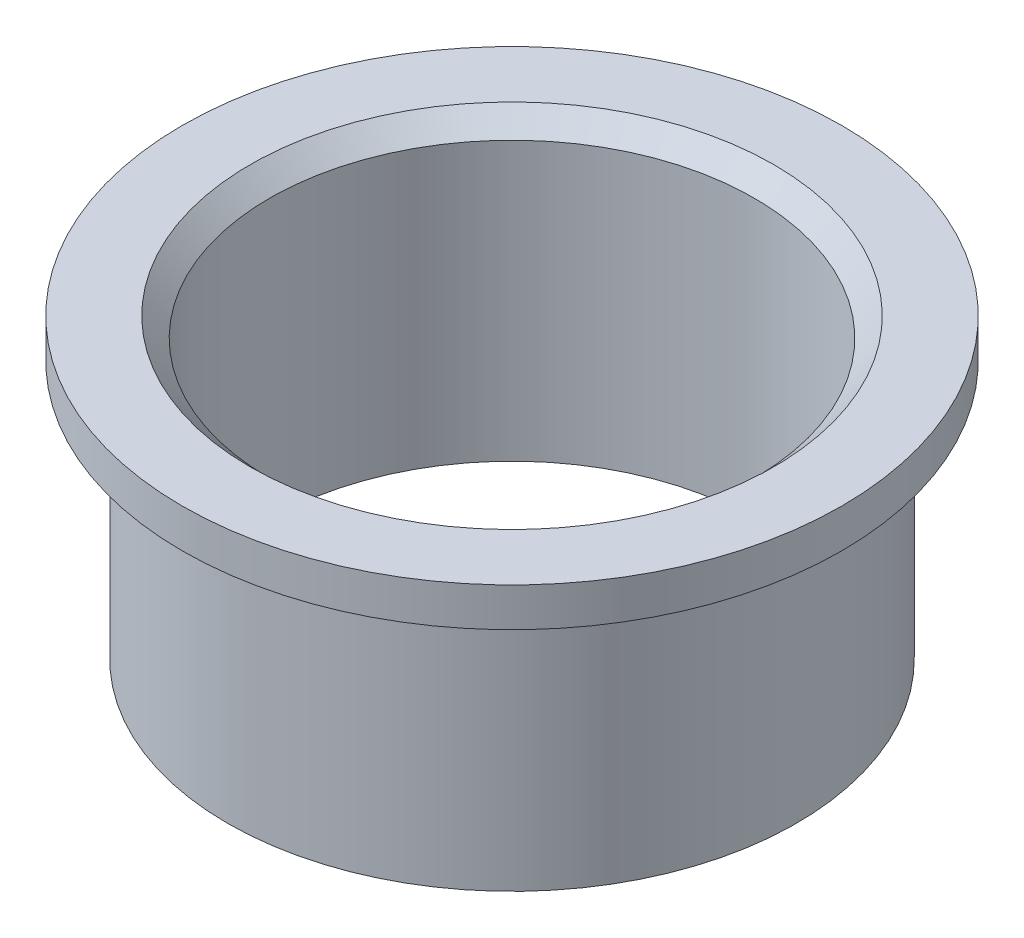
ISO-10303-21;
HEADER;
FILE_DESCRIPTION(('STEP AP214'),'2;1');
FILE_NAME('part.step','',(''),(''),'','','');
FILE_SCHEMA(('AUTOMOTIVE_DESIGN { 1 0 10303 214 1 1 1 1 }'));
ENDSEC;
DATA;
#1=APPLICATION_CONTEXT('core data for automotive mechanical design processes');
#2=APPLICATION_PROTOCOL_DEFINITION('international standard','automotive_design',2000,#1);
#3=PRODUCT_CONTEXT('',#1,'mechanical');
#4=PRODUCT('Part','Part','',(#3));
#5=PRODUCT_RELATED_PRODUCT_CATEGORY('part','',(#4));
#6=PRODUCT_DEFINITION_FORMATION('','',#4);
#7=PRODUCT_DEFINITION_CONTEXT('part definition',#1,'design');
#8=PRODUCT_DEFINITION('design','',#6,#7);
#9=PRODUCT_DEFINITION_SHAPE('','',#8);
#10=(LENGTH_UNIT() NAMED_UNIT(*) SI_UNIT(.MILLI.,.METRE.));
#11=(NAMED_UNIT(*) PLANE_ANGLE_UNIT() SI_UNIT($,.RADIAN.));
#12=(NAMED_UNIT(*) SI_UNIT($,.STERADIAN.) SOLID_ANGLE_UNIT());
#13=UNCERTAINTY_MEASURE_WITH_UNIT(LENGTH_MEASURE(1.E-05),#10,'distance_accuracy_value','');
#14=(GEOMETRIC_REPRESENTATION_CONTEXT(3) GLOBAL_UNCERTAINTY_ASSIGNED_CONTEXT((#13)) GLOBAL_UNIT_ASSIGNED_CONTEXT((#10,
#11,#12)) REPRESENTATION_CONTEXT('',''));
#15=CARTESIAN_POINT('',(0.,0.,0.));
#16=DIRECTION('',(0.,0.,1.));
#17=DIRECTION('',(1.,0.,0.));
#18=AXIS2_PLACEMENT_3D('',#15,#16,#17);
#19=CARTESIAN_POINT('',(0.,0.,0.));
#20=DIRECTION('',(0.,1.,0.));
#21=DIRECTION('',(0.,0.,1.));
#22=AXIS2_PLACEMENT_3D('',#19,#20,#21);
#23=CYLINDRICAL_SURFACE('',#22,51.);
#24=CARTESIAN_POINT('',(0.,-6.,0.));
#25=DIRECTION('',(0.,1.,0.));
#26=DIRECTION('',(0.,0.,1.));
#27=AXIS2_PLACEMENT_3D('',#24,#25,#26);
#28=CIRCLE('',#27,51.);
#29=CARTESIAN_POINT('',(0.,-6.,51.));
#30=VERTEX_POINT('',#29);
#31=EDGE_CURVE('E56',#30,#30,#28,.T.);
#32=ORIENTED_EDGE('',*,*,#31,.T.);
#33=EDGE_LOOP('',(#32));
#34=FACE_BOUND('',#33,.T.);
#35=CARTESIAN_POINT('',(0.,0.,0.));
#36=DIRECTION('',(0.,1.,0.));
#37=DIRECTION('',(0.,0.,1.));
#38=AXIS2_PLACEMENT_3D('',#35,#36,#37);
#39=CIRCLE('',#38,51.);
#40=CARTESIAN_POINT('',(0.,0.,51.));
#41=VERTEX_POINT('',#40);
#42=EDGE_CURVE('E10',#41,#41,#39,.T.);
#43=ORIENTED_EDGE('',*,*,#42,.F.);
#44=EDGE_LOOP('',(#43));
#45=FACE_BOUND('',#44,.T.);
#46=ADVANCED_FACE('F31',(#34,#45),#23,.T.);
#47=CARTESIAN_POINT('',(-51.,0.,0.));
#48=DIRECTION('',(0.,1.,0.));
#49=DIRECTION('',(0.,0.,1.));
#50=AXIS2_PLACEMENT_3D('',#47,#48,#49);
#51=PLANE('',#50);
#52=ORIENTED_EDGE('',*,*,#42,.T.);
#53=EDGE_LOOP('',(#52));
#54=FACE_BOUND('',#53,.T.);
#55=CARTESIAN_POINT('',(0.,0.,0.));
#56=DIRECTION('',(0.,1.,0.));
#57=DIRECTION('',(0.,0.,1.));
#58=AXIS2_PLACEMENT_3D('',#55,#56,#57);
#59=CIRCLE('',#58,40.5);
#60=CARTESIAN_POINT('',(0.,0.,40.5));
#61=VERTEX_POINT('',#60);
#62=EDGE_CURVE('E37',#61,#61,#59,.T.);
#63=ORIENTED_EDGE('',*,*,#62,.F.);
#64=EDGE_LOOP('',(#63));
#65=FACE_BOUND('',#64,.T.);
#66=ADVANCED_FACE('F74',(#54,#65),#51,.T.);
#67=CARTESIAN_POINT('',(0.,-3.,0.));
#68=DIRECTION('',(0.,1.,0.));
#69=DIRECTION('',(0.,0.,1.));
#70=AXIS2_PLACEMENT_3D('',#67,#68,#69);
#71=CONICAL_SURFACE('',#70,37.5,0.785398163397448);
#72=ORIENTED_EDGE('',*,*,#62,.T.);
#73=EDGE_LOOP('',(#72));
#74=FACE_BOUND('',#73,.T.);
#75=CARTESIAN_POINT('',(0.,-3.,0.));
#76=DIRECTION('',(0.,1.,0.));
#77=DIRECTION('',(0.,0.,1.));
#78=AXIS2_PLACEMENT_3D('',#75,#76,#77);
#79=CIRCLE('',#78,37.5);
#80=CARTESIAN_POINT('',(0.,-3.,37.5));
#81=VERTEX_POINT('',#80);
#82=EDGE_CURVE('E41',#81,#81,#79,.T.);
#83=ORIENTED_EDGE('',*,*,#82,.F.);
#84=EDGE_LOOP('',(#83));
#85=FACE_BOUND('',#84,.T.);
#86=ADVANCED_FACE('F78',(#74,#85),#71,.F.);
#87=CARTESIAN_POINT('',(0.,0.,0.));
#88=DIRECTION('',(0.,1.,0.));
#89=DIRECTION('',(0.,0.,1.));
#90=AXIS2_PLACEMENT_3D('',#87,#88,#89);
#91=CYLINDRICAL_SURFACE('',#90,37.5);
#92=ORIENTED_EDGE('',*,*,#82,.T.);
#93=EDGE_LOOP('',(#92));
#94=FACE_BOUND('',#93,.T.);
#95=CARTESIAN_POINT('',(0.,-46.,0.));
#96=DIRECTION('',(0.,1.,0.));
#97=DIRECTION('',(0.,0.,1.));
#98=AXIS2_PLACEMENT_3D('',#95,#96,#97);
#99=CIRCLE('',#98,37.5);
#100=CARTESIAN_POINT('',(0.,-46.,37.5));
#101=VERTEX_POINT('',#100);
#102=EDGE_CURVE('E45',#101,#101,#99,.T.);
#103=ORIENTED_EDGE('',*,*,#102,.F.);
#104=EDGE_LOOP('',(#103));
#105=FACE_BOUND('',#104,.T.);
#106=ADVANCED_FACE('F82',(#94,#105),#91,.F.);
#107=CARTESIAN_POINT('',(-37.5,-46.,0.));
#108=DIRECTION('',(0.,-1.,0.));
#109=DIRECTION('',(0.,0.,-1.));
#110=AXIS2_PLACEMENT_3D('',#107,#108,#109);
#111=PLANE('',#110);
#112=ORIENTED_EDGE('',*,*,#102,.T.);
#113=EDGE_LOOP('',(#112));
#114=FACE_BOUND('',#113,.T.);
#115=CARTESIAN_POINT('',(0.,-46.,0.));
#116=DIRECTION('',(0.,1.,0.));
#117=DIRECTION('',(0.,0.,1.));
#118=AXIS2_PLACEMENT_3D('',#115,#116,#117);
#119=CIRCLE('',#118,44.);
#120=CARTESIAN_POINT('',(0.,-46.,44.));
#121=VERTEX_POINT('',#120);
#122=EDGE_CURVE('E50',#121,#121,#119,.T.);
#123=ORIENTED_EDGE('',*,*,#122,.F.);
#124=EDGE_LOOP('',(#123));
#125=FACE_BOUND('',#124,.T.);
#126=ADVANCED_FACE('F70',(#114,#125),#111,.T.);
#127=CARTESIAN_POINT('',(0.,0.,0.));
#128=DIRECTION('',(0.,1.,0.));
#129=DIRECTION('',(0.,0.,1.));
#130=AXIS2_PLACEMENT_3D('',#127,#128,#129);
#131=CYLINDRICAL_SURFACE('',#130,44.);
#132=ORIENTED_EDGE('',*,*,#122,.T.);
#133=EDGE_LOOP('',(#132));
#134=FACE_BOUND('',#133,.T.);
#135=CARTESIAN_POINT('',(0.,-6.,0.));
#136=DIRECTION('',(0.,1.,0.));
#137=DIRECTION('',(0.,0.,1.));
#138=AXIS2_PLACEMENT_3D('',#135,#136,#137);
#139=CIRCLE('',#138,44.);
#140=CARTESIAN_POINT('',(0.,-6.,44.));
#141=VERTEX_POINT('',#140);
#142=EDGE_CURVE('E53',#141,#141,#139,.T.);
#143=ORIENTED_EDGE('',*,*,#142,.F.);
#144=EDGE_LOOP('',(#143));
#145=FACE_BOUND('',#144,.T.);
#146=ADVANCED_FACE('F64',(#134,#145),#131,.T.);
#147=CARTESIAN_POINT('',(-44.,-6.,0.));
#148=DIRECTION('',(0.,-1.,0.));
#149=DIRECTION('',(0.,0.,-1.));
#150=AXIS2_PLACEMENT_3D('',#147,#148,#149);
#151=PLANE('',#150);
#152=ORIENTED_EDGE('',*,*,#142,.T.);
#153=EDGE_LOOP('',(#152));
#154=FACE_BOUND('',#153,.T.);
#155=ORIENTED_EDGE('',*,*,#31,.F.);
#156=EDGE_LOOP('',(#155));
#157=FACE_BOUND('',#156,.T.);
#158=ADVANCED_FACE('F62',(#154,#157),#151,.T.);
#159=CLOSED_SHELL('',(#46,#66,#86,#106,#126,#146,#158));
#160=MANIFOLD_SOLID_BREP('B2',#159);
#161=ADVANCED_BREP_SHAPE_REPRESENTATION('',(#18,#160),#14);
#162=SHAPE_DEFINITION_REPRESENTATION(#9,#161);
ENDSEC;
END-ISO-10303-21;
